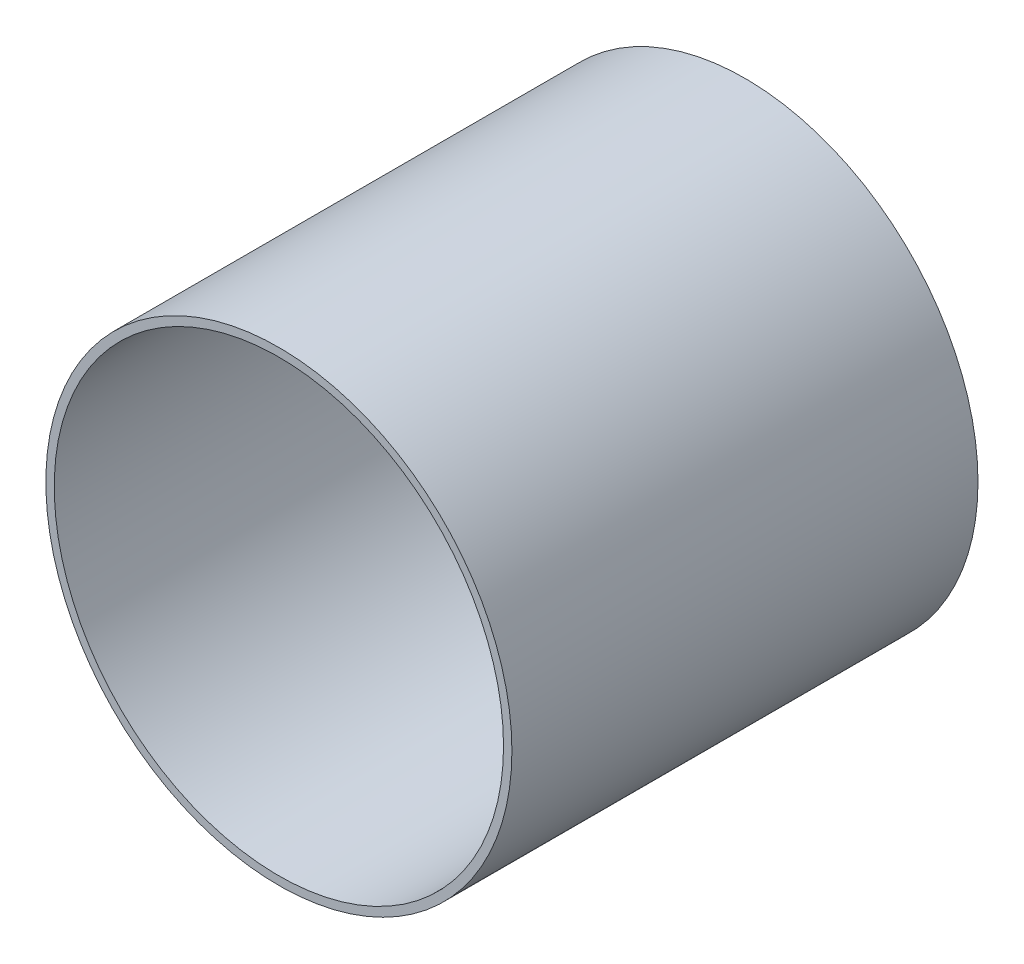
ISO-10303-21;
HEADER;
FILE_DESCRIPTION(('STEP AP214'),'2;1');
FILE_NAME('part.step','',(''),(''),'','','');
FILE_SCHEMA(('AUTOMOTIVE_DESIGN { 1 0 10303 214 1 1 1 1 }'));
ENDSEC;
DATA;
#1=APPLICATION_CONTEXT('core data for automotive mechanical design processes');
#2=APPLICATION_PROTOCOL_DEFINITION('international standard','automotive_design',2000,#1);
#3=PRODUCT_CONTEXT('',#1,'mechanical');
#4=PRODUCT('Part','Part','',(#3));
#5=PRODUCT_RELATED_PRODUCT_CATEGORY('part','',(#4));
#6=PRODUCT_DEFINITION_FORMATION('','',#4);
#7=PRODUCT_DEFINITION_CONTEXT('part definition',#1,'design');
#8=PRODUCT_DEFINITION('design','',#6,#7);
#9=PRODUCT_DEFINITION_SHAPE('','',#8);
#10=(LENGTH_UNIT() NAMED_UNIT(*) SI_UNIT(.MILLI.,.METRE.));
#11=(NAMED_UNIT(*) PLANE_ANGLE_UNIT() SI_UNIT($,.RADIAN.));
#12=(NAMED_UNIT(*) SI_UNIT($,.STERADIAN.) SOLID_ANGLE_UNIT());
#13=UNCERTAINTY_MEASURE_WITH_UNIT(LENGTH_MEASURE(1.E-05),#10,'distance_accuracy_value','');
#14=(GEOMETRIC_REPRESENTATION_CONTEXT(3) GLOBAL_UNCERTAINTY_ASSIGNED_CONTEXT((#13)) GLOBAL_UNIT_ASSIGNED_CONTEXT((#10,
#11,#12)) REPRESENTATION_CONTEXT('',''));
#15=CARTESIAN_POINT('',(0.,0.,0.));
#16=DIRECTION('',(0.,0.,1.));
#17=DIRECTION('',(1.,0.,0.));
#18=AXIS2_PLACEMENT_3D('',#15,#16,#17);
#19=CARTESIAN_POINT('',(0.,0.,25.));
#20=DIRECTION('',(0.,0.,1.));
#21=DIRECTION('',(1.,0.,0.));
#22=AXIS2_PLACEMENT_3D('',#19,#20,#21);
#23=PLANE('',#22);
#24=CARTESIAN_POINT('',(0.,0.,25.));
#25=DIRECTION('',(0.,0.,1.));
#26=DIRECTION('',(1.,0.,0.));
#27=AXIS2_PLACEMENT_3D('',#24,#25,#26);
#28=CIRCLE('',#27,12.5);
#29=CARTESIAN_POINT('',(12.5,0.,25.));
#30=VERTEX_POINT('',#29);
#31=EDGE_CURVE('E10',#30,#30,#28,.T.);
#32=ORIENTED_EDGE('',*,*,#31,.T.);
#33=EDGE_LOOP('',(#32));
#34=FACE_BOUND('',#33,.T.);
#35=CARTESIAN_POINT('',(0.,0.,25.));
#36=DIRECTION('',(0.,0.,1.));
#37=DIRECTION('',(1.,0.,0.));
#38=AXIS2_PLACEMENT_3D('',#35,#36,#37);
#39=CIRCLE('',#38,12.05);
#40=CARTESIAN_POINT('',(12.05,0.,25.));
#41=VERTEX_POINT('',#40);
#42=EDGE_CURVE('E42',#41,#41,#39,.T.);
#43=ORIENTED_EDGE('',*,*,#42,.F.);
#44=EDGE_LOOP('',(#43));
#45=FACE_BOUND('',#44,.T.);
#46=ADVANCED_FACE('F31',(#34,#45),#23,.T.);
#47=CARTESIAN_POINT('',(0.,0.,0.));
#48=DIRECTION('',(0.,0.,1.));
#49=DIRECTION('',(1.,0.,0.));
#50=AXIS2_PLACEMENT_3D('',#47,#48,#49);
#51=PLANE('',#50);
#52=CARTESIAN_POINT('',(0.,0.,0.));
#53=DIRECTION('',(0.,0.,1.));
#54=DIRECTION('',(1.,0.,0.));
#55=AXIS2_PLACEMENT_3D('',#52,#53,#54);
#56=CIRCLE('',#55,12.5);
#57=CARTESIAN_POINT('',(12.5,0.,0.));
#58=VERTEX_POINT('',#57);
#59=EDGE_CURVE('E35',#58,#58,#56,.T.);
#60=ORIENTED_EDGE('',*,*,#59,.F.);
#61=EDGE_LOOP('',(#60));
#62=FACE_BOUND('',#61,.T.);
#63=CARTESIAN_POINT('',(0.,0.,0.));
#64=DIRECTION('',(0.,0.,1.));
#65=DIRECTION('',(1.,0.,0.));
#66=AXIS2_PLACEMENT_3D('',#63,#64,#65);
#67=CIRCLE('',#66,12.05);
#68=CARTESIAN_POINT('',(12.05,0.,0.));
#69=VERTEX_POINT('',#68);
#70=EDGE_CURVE('E44',#69,#69,#67,.T.);
#71=ORIENTED_EDGE('',*,*,#70,.T.);
#72=EDGE_LOOP('',(#71));
#73=FACE_BOUND('',#72,.T.);
#74=ADVANCED_FACE('F54',(#62,#73),#51,.F.);
#75=CARTESIAN_POINT('',(0.,0.,25.));
#76=DIRECTION('',(0.,0.,-1.));
#77=DIRECTION('',(-1.,0.,0.));
#78=AXIS2_PLACEMENT_3D('',#75,#76,#77);
#79=CYLINDRICAL_SURFACE('',#78,12.5);
#80=ORIENTED_EDGE('',*,*,#31,.F.);
#81=EDGE_LOOP('',(#80));
#82=FACE_BOUND('',#81,.T.);
#83=ORIENTED_EDGE('',*,*,#59,.T.);
#84=EDGE_LOOP('',(#83));
#85=FACE_BOUND('',#84,.T.);
#86=ADVANCED_FACE('F33',(#82,#85),#79,.T.);
#87=CARTESIAN_POINT('',(0.,0.,25.));
#88=DIRECTION('',(0.,0.,-1.));
#89=DIRECTION('',(-1.,0.,0.));
#90=AXIS2_PLACEMENT_3D('',#87,#88,#89);
#91=CYLINDRICAL_SURFACE('',#90,12.05);
#92=ORIENTED_EDGE('',*,*,#42,.T.);
#93=EDGE_LOOP('',(#92));
#94=FACE_BOUND('',#93,.T.);
#95=ORIENTED_EDGE('',*,*,#70,.F.);
#96=EDGE_LOOP('',(#95));
#97=FACE_BOUND('',#96,.T.);
#98=ADVANCED_FACE('F50',(#94,#97),#91,.F.);
#99=CLOSED_SHELL('',(#46,#74,#86,#98));
#100=MANIFOLD_SOLID_BREP('B2',#99);
#101=ADVANCED_BREP_SHAPE_REPRESENTATION('',(#18,#100),#14);
#102=SHAPE_DEFINITION_REPRESENTATION(#9,#101);
ENDSEC;
END-ISO-10303-21;
